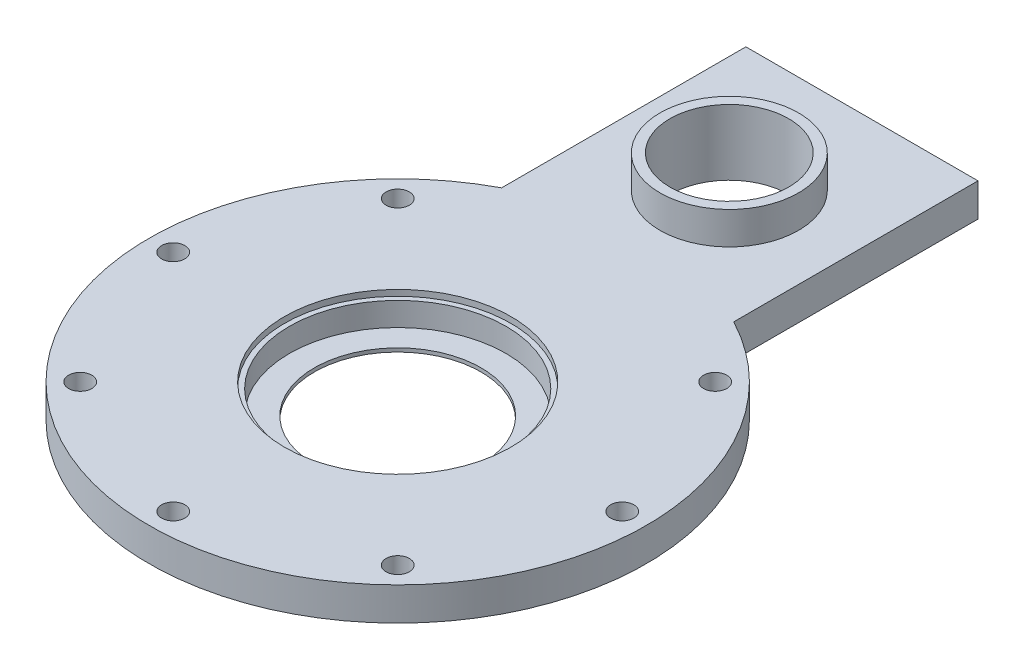
ISO-10303-21;
HEADER;
FILE_DESCRIPTION(('STEP AP214'),'2;1');
FILE_NAME('part.step','',(''),(''),'','','');
FILE_SCHEMA(('AUTOMOTIVE_DESIGN { 1 0 10303 214 1 1 1 1 }'));
ENDSEC;
DATA;
#1=APPLICATION_CONTEXT('core data for automotive mechanical design processes');
#2=APPLICATION_PROTOCOL_DEFINITION('international standard','automotive_design',2000,#1);
#3=PRODUCT_CONTEXT('',#1,'mechanical');
#4=PRODUCT('Part','Part','',(#3));
#5=PRODUCT_RELATED_PRODUCT_CATEGORY('part','',(#4));
#6=PRODUCT_DEFINITION_FORMATION('','',#4);
#7=PRODUCT_DEFINITION_CONTEXT('part definition',#1,'design');
#8=PRODUCT_DEFINITION('design','',#6,#7);
#9=PRODUCT_DEFINITION_SHAPE('','',#8);
#10=(LENGTH_UNIT() NAMED_UNIT(*) SI_UNIT(.MILLI.,.METRE.));
#11=(NAMED_UNIT(*) PLANE_ANGLE_UNIT() SI_UNIT($,.RADIAN.));
#12=(NAMED_UNIT(*) SI_UNIT($,.STERADIAN.) SOLID_ANGLE_UNIT());
#13=UNCERTAINTY_MEASURE_WITH_UNIT(LENGTH_MEASURE(1.E-05),#10,'distance_accuracy_value','');
#14=(GEOMETRIC_REPRESENTATION_CONTEXT(3) GLOBAL_UNCERTAINTY_ASSIGNED_CONTEXT((#13)) GLOBAL_UNIT_ASSIGNED_CONTEXT((#10,
#11,#12)) REPRESENTATION_CONTEXT('',''));
#15=CARTESIAN_POINT('',(0.,0.,0.));
#16=DIRECTION('',(0.,0.,1.));
#17=DIRECTION('',(1.,0.,0.));
#18=AXIS2_PLACEMENT_3D('',#15,#16,#17);
#19=CARTESIAN_POINT('',(0.,10.,100.));
#20=DIRECTION('',(0.,1.,0.));
#21=DIRECTION('',(0.,0.,1.));
#22=AXIS2_PLACEMENT_3D('',#19,#20,#21);
#23=PLANE('',#22);
#24=CARTESIAN_POINT('',(67.7000000000011,10.,99.9999999999993));
#25=DIRECTION('',(0.,1.,0.));
#26=DIRECTION('',(0.,0.,1.));
#27=AXIS2_PLACEMENT_3D('',#24,#25,#26);
#28=CIRCLE('',#27,3.49999999999997);
#29=CARTESIAN_POINT('',(67.7000000000011,10.,103.499999999999));
#30=VERTEX_POINT('',#29);
#31=EDGE_CURVE('E124',#30,#30,#28,.T.);
#32=ORIENTED_EDGE('',*,*,#31,.F.);
#33=EDGE_LOOP('',(#32));
#34=FACE_BOUND('',#33,.T.);
#35=CARTESIAN_POINT('',(47.8711290863305,10.,147.87112908633));
#36=DIRECTION('',(0.,1.,0.));
#37=DIRECTION('',(0.,0.,1.));
#38=AXIS2_PLACEMENT_3D('',#35,#36,#37);
#39=CIRCLE('',#38,3.49999999999997);
#40=CARTESIAN_POINT('',(47.8711290863305,10.,151.37112908633));
#41=VERTEX_POINT('',#40);
#42=EDGE_CURVE('E131',#41,#41,#39,.T.);
#43=ORIENTED_EDGE('',*,*,#42,.F.);
#44=EDGE_LOOP('',(#43));
#45=FACE_BOUND('',#44,.T.);
#46=CARTESIAN_POINT('',(4.44089209850063E-13,10.,167.700000000001));
#47=DIRECTION('',(0.,1.,0.));
#48=DIRECTION('',(0.,0.,1.));
#49=AXIS2_PLACEMENT_3D('',#46,#47,#48);
#50=CIRCLE('',#49,3.50000000000002);
#51=CARTESIAN_POINT('',(4.44089209850063E-13,10.,171.200000000001));
#52=VERTEX_POINT('',#51);
#53=EDGE_CURVE('E137',#52,#52,#50,.T.);
#54=ORIENTED_EDGE('',*,*,#53,.F.);
#55=EDGE_LOOP('',(#54));
#56=FACE_BOUND('',#55,.T.);
#57=CARTESIAN_POINT('',(-47.8711290863298,10.,147.87112908633));
#58=DIRECTION('',(0.,1.,0.));
#59=DIRECTION('',(0.,0.,1.));
#60=AXIS2_PLACEMENT_3D('',#57,#58,#59);
#61=CIRCLE('',#60,3.49999999999997);
#62=CARTESIAN_POINT('',(-47.8711290863298,10.,151.37112908633));
#63=VERTEX_POINT('',#62);
#64=EDGE_CURVE('E143',#63,#63,#61,.T.);
#65=ORIENTED_EDGE('',*,*,#64,.F.);
#66=EDGE_LOOP('',(#65));
#67=FACE_BOUND('',#66,.T.);
#68=CARTESIAN_POINT('',(-67.7000000000012,10.,100.));
#69=DIRECTION('',(0.,1.,0.));
#70=DIRECTION('',(0.,0.,1.));
#71=AXIS2_PLACEMENT_3D('',#68,#69,#70);
#72=CIRCLE('',#71,3.49999999999998);
#73=CARTESIAN_POINT('',(-67.7000000000012,10.,103.5));
#74=VERTEX_POINT('',#73);
#75=EDGE_CURVE('E111',#74,#74,#72,.T.);
#76=ORIENTED_EDGE('',*,*,#75,.F.);
#77=EDGE_LOOP('',(#76));
#78=FACE_BOUND('',#77,.T.);
#79=CARTESIAN_POINT('',(-47.8711290863301,10.,52.12887091367));
#80=DIRECTION('',(0.,1.,0.));
#81=DIRECTION('',(0.,0.,1.));
#82=AXIS2_PLACEMENT_3D('',#79,#80,#81);
#83=CIRCLE('',#82,3.50000000000003);
#84=CARTESIAN_POINT('',(-47.8711290863301,10.,55.62887091367));
#85=VERTEX_POINT('',#84);
#86=EDGE_CURVE('E118',#85,#85,#83,.T.);
#87=ORIENTED_EDGE('',*,*,#86,.F.);
#88=EDGE_LOOP('',(#87));
#89=FACE_BOUND('',#88,.T.);
#90=CARTESIAN_POINT('',(47.8711290863295,10.,52.1288709136694));
#91=DIRECTION('',(0.,1.,0.));
#92=DIRECTION('',(0.,0.,1.));
#93=AXIS2_PLACEMENT_3D('',#90,#91,#92);
#94=CIRCLE('',#93,3.50000000000002);
#95=CARTESIAN_POINT('',(47.8711290863295,10.,55.6288709136694));
#96=VERTEX_POINT('',#95);
#97=EDGE_CURVE('E127',#96,#96,#94,.T.);
#98=ORIENTED_EDGE('',*,*,#97,.F.);
#99=EDGE_LOOP('',(#98));
#100=FACE_BOUND('',#99,.T.);
#101=CARTESIAN_POINT('',(0.,10.,100.));
#102=DIRECTION('',(0.,1.,0.));
#103=DIRECTION('',(0.,0.,1.));
#104=AXIS2_PLACEMENT_3D('',#101,#102,#103);
#105=CIRCLE('',#104,34.15);
#106=CARTESIAN_POINT('',(0.,10.,134.15));
#107=VERTEX_POINT('',#106);
#108=EDGE_CURVE('E176',#107,#107,#105,.T.);
#109=ORIENTED_EDGE('',*,*,#108,.F.);
#110=EDGE_LOOP('',(#109));
#111=FACE_BOUND('',#110,.T.);
#112=CARTESIAN_POINT('',(0.,10.,0.));
#113=DIRECTION('',(0.,1.,0.));
#114=DIRECTION('',(0.,0.,1.));
#115=AXIS2_PLACEMENT_3D('',#112,#113,#114);
#116=CIRCLE('',#115,20.9);
#117=CARTESIAN_POINT('',(0.,10.,20.9));
#118=VERTEX_POINT('',#117);
#119=EDGE_CURVE('E161',#118,#118,#116,.T.);
#120=ORIENTED_EDGE('',*,*,#119,.F.);
#121=EDGE_LOOP('',(#120));
#122=FACE_BOUND('',#121,.T.);
#123=DIRECTION('',(0.,0.,-1.));
#124=VECTOR('',#123,1.);
#125=CARTESIAN_POINT('',(-34.999999999999,10.,0.));
#126=LINE('',#125,#124);
#127=CARTESIAN_POINT('',(-34.999999999999,10.,33.66750419289));
#128=VERTEX_POINT('',#127);
#129=CARTESIAN_POINT('',(-34.999999999999,10.,-40.0000000000003));
#130=VERTEX_POINT('',#129);
#131=EDGE_CURVE('E59',#128,#130,#126,.T.);
#132=ORIENTED_EDGE('',*,*,#131,.F.);
#133=CARTESIAN_POINT('',(0.,10.,100.));
#134=DIRECTION('',(0.,1.,0.));
#135=DIRECTION('',(0.,0.,1.));
#136=AXIS2_PLACEMENT_3D('',#133,#134,#135);
#137=CIRCLE('',#136,75.);
#138=CARTESIAN_POINT('',(34.999999999999,10.,33.66750419289));
#139=VERTEX_POINT('',#138);
#140=EDGE_CURVE('E84',#139,#128,#137,.F.);
#141=ORIENTED_EDGE('',*,*,#140,.F.);
#142=DIRECTION('',(0.,0.,-1.));
#143=VECTOR('',#142,1.);
#144=CARTESIAN_POINT('',(34.999999999999,10.,0.));
#145=LINE('',#144,#143);
#146=CARTESIAN_POINT('',(34.999999999999,10.,-39.9999999999998));
#147=VERTEX_POINT('',#146);
#148=EDGE_CURVE('E87',#139,#147,#145,.T.);
#149=ORIENTED_EDGE('',*,*,#148,.T.);
#150=DIRECTION('',(-1.,0.,0.));
#151=VECTOR('',#150,1.);
#152=CARTESIAN_POINT('',(2.71387850463927E-13,10.,-40.));
#153=LINE('',#152,#151);
#154=EDGE_CURVE('E156',#147,#130,#153,.T.);
#155=ORIENTED_EDGE('',*,*,#154,.T.);
#156=EDGE_LOOP('',(#132,#141,#149,#155));
#157=FACE_BOUND('',#156,.T.);
#158=ADVANCED_FACE('F42',(#34,#45,#56,#67,#78,#89,#100,#111,#122,#157),#23,.T.);
#159=CARTESIAN_POINT('',(0.,0.,100.));
#160=DIRECTION('',(0.,1.,0.));
#161=DIRECTION('',(0.,0.,1.));
#162=AXIS2_PLACEMENT_3D('',#159,#160,#161);
#163=PLANE('',#162);
#164=CARTESIAN_POINT('',(67.7000000000011,0.,99.9999999999993));
#165=DIRECTION('',(0.,1.,0.));
#166=DIRECTION('',(0.,0.,1.));
#167=AXIS2_PLACEMENT_3D('',#164,#165,#166);
#168=CIRCLE('',#167,3.49999999999997);
#169=CARTESIAN_POINT('',(67.7000000000011,0.,103.499999999999));
#170=VERTEX_POINT('',#169);
#171=EDGE_CURVE('E128',#170,#170,#168,.T.);
#172=ORIENTED_EDGE('',*,*,#171,.T.);
#173=EDGE_LOOP('',(#172));
#174=FACE_BOUND('',#173,.T.);
#175=CARTESIAN_POINT('',(47.8711290863305,0.,147.87112908633));
#176=DIRECTION('',(0.,1.,0.));
#177=DIRECTION('',(0.,0.,1.));
#178=AXIS2_PLACEMENT_3D('',#175,#176,#177);
#179=CIRCLE('',#178,3.49999999999997);
#180=CARTESIAN_POINT('',(47.8711290863305,0.,151.37112908633));
#181=VERTEX_POINT('',#180);
#182=EDGE_CURVE('E134',#181,#181,#179,.T.);
#183=ORIENTED_EDGE('',*,*,#182,.T.);
#184=EDGE_LOOP('',(#183));
#185=FACE_BOUND('',#184,.T.);
#186=CARTESIAN_POINT('',(4.44089209850063E-13,0.,167.700000000001));
#187=DIRECTION('',(0.,1.,0.));
#188=DIRECTION('',(0.,0.,1.));
#189=AXIS2_PLACEMENT_3D('',#186,#187,#188);
#190=CIRCLE('',#189,3.50000000000002);
#191=CARTESIAN_POINT('',(4.44089209850063E-13,0.,171.200000000001));
#192=VERTEX_POINT('',#191);
#193=EDGE_CURVE('E140',#192,#192,#190,.T.);
#194=ORIENTED_EDGE('',*,*,#193,.T.);
#195=EDGE_LOOP('',(#194));
#196=FACE_BOUND('',#195,.T.);
#197=CARTESIAN_POINT('',(-47.8711290863298,0.,147.87112908633));
#198=DIRECTION('',(0.,1.,0.));
#199=DIRECTION('',(0.,0.,1.));
#200=AXIS2_PLACEMENT_3D('',#197,#198,#199);
#201=CIRCLE('',#200,3.49999999999997);
#202=CARTESIAN_POINT('',(-47.8711290863298,0.,151.37112908633));
#203=VERTEX_POINT('',#202);
#204=EDGE_CURVE('E114',#203,#203,#201,.T.);
#205=ORIENTED_EDGE('',*,*,#204,.T.);
#206=EDGE_LOOP('',(#205));
#207=FACE_BOUND('',#206,.T.);
#208=CARTESIAN_POINT('',(-67.7000000000012,0.,100.));
#209=DIRECTION('',(0.,1.,0.));
#210=DIRECTION('',(0.,0.,1.));
#211=AXIS2_PLACEMENT_3D('',#208,#209,#210);
#212=CIRCLE('',#211,3.49999999999998);
#213=CARTESIAN_POINT('',(-67.7000000000012,0.,103.5));
#214=VERTEX_POINT('',#213);
#215=EDGE_CURVE('E115',#214,#214,#212,.T.);
#216=ORIENTED_EDGE('',*,*,#215,.T.);
#217=EDGE_LOOP('',(#216));
#218=FACE_BOUND('',#217,.T.);
#219=CARTESIAN_POINT('',(-47.8711290863301,0.,52.12887091367));
#220=DIRECTION('',(0.,1.,0.));
#221=DIRECTION('',(0.,0.,1.));
#222=AXIS2_PLACEMENT_3D('',#219,#220,#221);
#223=CIRCLE('',#222,3.50000000000003);
#224=CARTESIAN_POINT('',(-47.8711290863301,0.,55.62887091367));
#225=VERTEX_POINT('',#224);
#226=EDGE_CURVE('E121',#225,#225,#223,.T.);
#227=ORIENTED_EDGE('',*,*,#226,.T.);
#228=EDGE_LOOP('',(#227));
#229=FACE_BOUND('',#228,.T.);
#230=CARTESIAN_POINT('',(47.8711290863295,0.,52.1288709136694));
#231=DIRECTION('',(0.,1.,0.));
#232=DIRECTION('',(0.,0.,1.));
#233=AXIS2_PLACEMENT_3D('',#230,#231,#232);
#234=CIRCLE('',#233,3.50000000000002);
#235=CARTESIAN_POINT('',(47.8711290863295,0.,55.6288709136694));
#236=VERTEX_POINT('',#235);
#237=EDGE_CURVE('E148',#236,#236,#234,.T.);
#238=ORIENTED_EDGE('',*,*,#237,.T.);
#239=EDGE_LOOP('',(#238));
#240=FACE_BOUND('',#239,.T.);
#241=CARTESIAN_POINT('',(0.,0.,0.));
#242=DIRECTION('',(0.,1.,0.));
#243=DIRECTION('',(0.,0.,1.));
#244=AXIS2_PLACEMENT_3D('',#241,#242,#243);
#245=CIRCLE('',#244,17.9);
#246=CARTESIAN_POINT('',(0.,0.,17.9));
#247=VERTEX_POINT('',#246);
#248=EDGE_CURVE('E11',#247,#247,#245,.T.);
#249=ORIENTED_EDGE('',*,*,#248,.T.);
#250=EDGE_LOOP('',(#249));
#251=FACE_BOUND('',#250,.T.);
#252=CARTESIAN_POINT('',(0.,0.,100.));
#253=DIRECTION('',(0.,1.,0.));
#254=DIRECTION('',(0.,0.,1.));
#255=AXIS2_PLACEMENT_3D('',#252,#253,#254);
#256=CIRCLE('',#255,25.15);
#257=CARTESIAN_POINT('',(0.,0.,125.15));
#258=VERTEX_POINT('',#257);
#259=EDGE_CURVE('E51',#258,#258,#256,.T.);
#260=ORIENTED_EDGE('',*,*,#259,.T.);
#261=EDGE_LOOP('',(#260));
#262=FACE_BOUND('',#261,.T.);
#263=CARTESIAN_POINT('',(0.,0.,100.));
#264=DIRECTION('',(0.,-1.,0.));
#265=DIRECTION('',(0.,0.,-1.));
#266=AXIS2_PLACEMENT_3D('',#263,#264,#265);
#267=CIRCLE('',#266,75.);
#268=CARTESIAN_POINT('',(34.999999999999,0.,33.66750419289));
#269=VERTEX_POINT('',#268);
#270=CARTESIAN_POINT('',(-34.999999999999,0.,33.66750419289));
#271=VERTEX_POINT('',#270);
#272=EDGE_CURVE('E93',#269,#271,#267,.T.);
#273=ORIENTED_EDGE('',*,*,#272,.T.);
#274=DIRECTION('',(0.,0.,-1.));
#275=VECTOR('',#274,1.);
#276=CARTESIAN_POINT('',(-34.999999999999,0.,0.));
#277=LINE('',#276,#275);
#278=CARTESIAN_POINT('',(-34.999999999999,0.,-40.0000000000003));
#279=VERTEX_POINT('',#278);
#280=EDGE_CURVE('E106',#271,#279,#277,.T.);
#281=ORIENTED_EDGE('',*,*,#280,.T.);
#282=DIRECTION('',(-1.,0.,0.));
#283=VECTOR('',#282,1.);
#284=CARTESIAN_POINT('',(2.71387850463927E-13,0.,-40.));
#285=LINE('',#284,#283);
#286=CARTESIAN_POINT('',(34.999999999999,0.,-39.9999999999998));
#287=VERTEX_POINT('',#286);
#288=EDGE_CURVE('E151',#287,#279,#285,.T.);
#289=ORIENTED_EDGE('',*,*,#288,.F.);
#290=DIRECTION('',(0.,0.,-1.));
#291=VECTOR('',#290,1.);
#292=CARTESIAN_POINT('',(34.999999999999,0.,0.));
#293=LINE('',#292,#291);
#294=EDGE_CURVE('E102',#269,#287,#293,.T.);
#295=ORIENTED_EDGE('',*,*,#294,.F.);
#296=EDGE_LOOP('',(#273,#281,#289,#295));
#297=FACE_BOUND('',#296,.T.);
#298=ADVANCED_FACE('F44',(#174,#185,#196,#207,#218,#229,#240,#251,#262,#297),#163,.F.);
#299=CARTESIAN_POINT('',(2.71387850463927E-13,205.039141144791,-40.));
#300=DIRECTION('',(0.,0.,1.));
#301=DIRECTION('',(1.,0.,0.));
#302=AXIS2_PLACEMENT_3D('',#299,#300,#301);
#303=PLANE('',#302);
#304=ORIENTED_EDGE('',*,*,#288,.T.);
#305=DIRECTION('',(0.,1.,0.));
#306=VECTOR('',#305,1.);
#307=CARTESIAN_POINT('',(-34.999999999999,0.,-40.0000000000003));
#308=LINE('',#307,#306);
#309=EDGE_CURVE('E64',#279,#130,#308,.T.);
#310=ORIENTED_EDGE('',*,*,#309,.T.);
#311=ORIENTED_EDGE('',*,*,#154,.F.);
#312=DIRECTION('',(0.,1.,0.));
#313=VECTOR('',#312,1.);
#314=CARTESIAN_POINT('',(34.999999999999,0.,-39.9999999999998));
#315=LINE('',#314,#313);
#316=EDGE_CURVE('E101',#287,#147,#315,.T.);
#317=ORIENTED_EDGE('',*,*,#316,.F.);
#318=EDGE_LOOP('',(#304,#310,#311,#317));
#319=FACE_BOUND('',#318,.T.);
#320=ADVANCED_FACE('F187',(#319),#303,.F.);
#321=CARTESIAN_POINT('',(0.,0.,100.));
#322=DIRECTION('',(0.,1.,0.));
#323=DIRECTION('',(0.,0.,1.));
#324=AXIS2_PLACEMENT_3D('',#321,#322,#323);
#325=CYLINDRICAL_SURFACE('',#324,25.15);
#326=ORIENTED_EDGE('',*,*,#259,.F.);
#327=EDGE_LOOP('',(#326));
#328=FACE_BOUND('',#327,.T.);
#329=CARTESIAN_POINT('',(0.,1.1,100.));
#330=DIRECTION('',(0.,1.,0.));
#331=DIRECTION('',(0.,0.,1.));
#332=AXIS2_PLACEMENT_3D('',#329,#330,#331);
#333=CIRCLE('',#332,25.15);
#334=CARTESIAN_POINT('',(0.,1.1,125.15));
#335=VERTEX_POINT('',#334);
#336=EDGE_CURVE('E46',#335,#335,#333,.F.);
#337=ORIENTED_EDGE('',*,*,#336,.F.);
#338=EDGE_LOOP('',(#337));
#339=FACE_BOUND('',#338,.T.);
#340=ADVANCED_FACE('F183',(#328,#339),#325,.F.);
#341=CARTESIAN_POINT('',(0.,0.,0.));
#342=DIRECTION('',(0.,1.,0.));
#343=DIRECTION('',(0.,0.,1.));
#344=AXIS2_PLACEMENT_3D('',#341,#342,#343);
#345=CYLINDRICAL_SURFACE('',#344,17.9);
#346=ORIENTED_EDGE('',*,*,#248,.F.);
#347=EDGE_LOOP('',(#346));
#348=FACE_BOUND('',#347,.T.);
#349=CARTESIAN_POINT('',(0.,19.8,0.));
#350=DIRECTION('',(0.,1.,0.));
#351=DIRECTION('',(0.,0.,1.));
#352=AXIS2_PLACEMENT_3D('',#349,#350,#351);
#353=CIRCLE('',#352,17.9);
#354=CARTESIAN_POINT('',(0.,19.8,17.9));
#355=VERTEX_POINT('',#354);
#356=EDGE_CURVE('E92',#355,#355,#353,.T.);
#357=ORIENTED_EDGE('',*,*,#356,.T.);
#358=EDGE_LOOP('',(#357));
#359=FACE_BOUND('',#358,.T.);
#360=ADVANCED_FACE('F186',(#348,#359),#345,.F.);
#361=CARTESIAN_POINT('',(0.,8.2,100.));
#362=DIRECTION('',(0.,1.,0.));
#363=DIRECTION('',(0.,0.,1.));
#364=AXIS2_PLACEMENT_3D('',#361,#362,#363);
#365=PLANE('',#364);
#366=CARTESIAN_POINT('',(0.,8.2,100.));
#367=DIRECTION('',(0.,1.,0.));
#368=DIRECTION('',(0.,0.,1.));
#369=AXIS2_PLACEMENT_3D('',#366,#367,#368);
#370=CIRCLE('',#369,32.65);
#371=CARTESIAN_POINT('',(0.,8.2,132.65));
#372=VERTEX_POINT('',#371);
#373=EDGE_CURVE('E165',#372,#372,#370,.T.);
#374=ORIENTED_EDGE('',*,*,#373,.F.);
#375=EDGE_LOOP('',(#374));
#376=FACE_BOUND('',#375,.T.);
#377=CARTESIAN_POINT('',(0.,8.2,100.));
#378=DIRECTION('',(0.,1.,0.));
#379=DIRECTION('',(0.,0.,1.));
#380=AXIS2_PLACEMENT_3D('',#377,#378,#379);
#381=CIRCLE('',#380,34.15);
#382=CARTESIAN_POINT('',(0.,8.2,134.15));
#383=VERTEX_POINT('',#382);
#384=EDGE_CURVE('E173',#383,#383,#381,.T.);
#385=ORIENTED_EDGE('',*,*,#384,.T.);
#386=EDGE_LOOP('',(#385));
#387=FACE_BOUND('',#386,.T.);
#388=ADVANCED_FACE('F206',(#376,#387),#365,.T.);
#389=CARTESIAN_POINT('',(0.,8.2,100.));
#390=DIRECTION('',(0.,1.,0.));
#391=DIRECTION('',(0.,0.,1.));
#392=AXIS2_PLACEMENT_3D('',#389,#390,#391);
#393=CYLINDRICAL_SURFACE('',#392,34.15);
#394=ORIENTED_EDGE('',*,*,#384,.F.);
#395=EDGE_LOOP('',(#394));
#396=FACE_BOUND('',#395,.T.);
#397=ORIENTED_EDGE('',*,*,#108,.T.);
#398=EDGE_LOOP('',(#397));
#399=FACE_BOUND('',#398,.T.);
#400=ADVANCED_FACE('F195',(#396,#399),#393,.F.);
#401=CARTESIAN_POINT('',(0.,1.1,100.));
#402=DIRECTION('',(0.,1.,0.));
#403=DIRECTION('',(0.,0.,1.));
#404=AXIS2_PLACEMENT_3D('',#401,#402,#403);
#405=PLANE('',#404);
#406=CARTESIAN_POINT('',(0.,1.1,100.));
#407=DIRECTION('',(0.,1.,0.));
#408=DIRECTION('',(0.,0.,1.));
#409=AXIS2_PLACEMENT_3D('',#406,#407,#408);
#410=CIRCLE('',#409,32.65);
#411=CARTESIAN_POINT('',(0.,1.1,132.65));
#412=VERTEX_POINT('',#411);
#413=EDGE_CURVE('E168',#412,#412,#410,.T.);
#414=ORIENTED_EDGE('',*,*,#413,.T.);
#415=EDGE_LOOP('',(#414));
#416=FACE_BOUND('',#415,.T.);
#417=ORIENTED_EDGE('',*,*,#336,.T.);
#418=EDGE_LOOP('',(#417));
#419=FACE_BOUND('',#418,.T.);
#420=ADVANCED_FACE('F192',(#416,#419),#405,.T.);
#421=CARTESIAN_POINT('',(0.,1.1,100.));
#422=DIRECTION('',(0.,1.,0.));
#423=DIRECTION('',(0.,0.,1.));
#424=AXIS2_PLACEMENT_3D('',#421,#422,#423);
#425=CYLINDRICAL_SURFACE('',#424,32.65);
#426=ORIENTED_EDGE('',*,*,#413,.F.);
#427=EDGE_LOOP('',(#426));
#428=FACE_BOUND('',#427,.T.);
#429=ORIENTED_EDGE('',*,*,#373,.T.);
#430=EDGE_LOOP('',(#429));
#431=FACE_BOUND('',#430,.T.);
#432=ADVANCED_FACE('F194',(#428,#431),#425,.F.);
#433=CARTESIAN_POINT('',(0.,19.8,0.));
#434=DIRECTION('',(0.,1.,0.));
#435=DIRECTION('',(0.,0.,1.));
#436=AXIS2_PLACEMENT_3D('',#433,#434,#435);
#437=PLANE('',#436);
#438=CARTESIAN_POINT('',(0.,19.8,0.));
#439=DIRECTION('',(0.,1.,0.));
#440=DIRECTION('',(0.,0.,1.));
#441=AXIS2_PLACEMENT_3D('',#438,#439,#440);
#442=CIRCLE('',#441,20.9);
#443=CARTESIAN_POINT('',(0.,19.8,20.9));
#444=VERTEX_POINT('',#443);
#445=EDGE_CURVE('E162',#444,#444,#442,.T.);
#446=ORIENTED_EDGE('',*,*,#445,.T.);
#447=EDGE_LOOP('',(#446));
#448=FACE_BOUND('',#447,.T.);
#449=ORIENTED_EDGE('',*,*,#356,.F.);
#450=EDGE_LOOP('',(#449));
#451=FACE_BOUND('',#450,.T.);
#452=ADVANCED_FACE('F202',(#448,#451),#437,.T.);
#453=CARTESIAN_POINT('',(0.,19.8,0.));
#454=DIRECTION('',(0.,-1.,0.));
#455=DIRECTION('',(0.,0.,-1.));
#456=AXIS2_PLACEMENT_3D('',#453,#454,#455);
#457=CYLINDRICAL_SURFACE('',#456,20.9);
#458=ORIENTED_EDGE('',*,*,#445,.F.);
#459=EDGE_LOOP('',(#458));
#460=FACE_BOUND('',#459,.T.);
#461=ORIENTED_EDGE('',*,*,#119,.T.);
#462=EDGE_LOOP('',(#461));
#463=FACE_BOUND('',#462,.T.);
#464=ADVANCED_FACE('F235',(#460,#463),#457,.T.);
#465=CARTESIAN_POINT('',(0.,205.039141144791,100.));
#466=DIRECTION('',(0.,-1.,0.));
#467=DIRECTION('',(0.,0.,-1.));
#468=AXIS2_PLACEMENT_3D('',#465,#466,#467);
#469=CYLINDRICAL_SURFACE('',#468,75.);
#470=ORIENTED_EDGE('',*,*,#272,.F.);
#471=DIRECTION('',(0.,1.,0.));
#472=VECTOR('',#471,1.);
#473=CARTESIAN_POINT('',(34.999999999999,0.,33.66750419289));
#474=LINE('',#473,#472);
#475=EDGE_CURVE('E98',#269,#139,#474,.T.);
#476=ORIENTED_EDGE('',*,*,#475,.T.);
#477=ORIENTED_EDGE('',*,*,#140,.T.);
#478=DIRECTION('',(0.,1.,0.));
#479=VECTOR('',#478,1.);
#480=CARTESIAN_POINT('',(-34.999999999999,0.,33.66750419289));
#481=LINE('',#480,#479);
#482=EDGE_CURVE('E481',#271,#128,#481,.T.);
#483=ORIENTED_EDGE('',*,*,#482,.F.);
#484=EDGE_LOOP('',(#470,#476,#477,#483));
#485=FACE_BOUND('',#484,.T.);
#486=ADVANCED_FACE('F104',(#485),#469,.T.);
#487=CARTESIAN_POINT('',(47.8711290863295,0.,52.1288709136694));
#488=DIRECTION('',(0.,1.,0.));
#489=DIRECTION('',(0.,0.,1.));
#490=AXIS2_PLACEMENT_3D('',#487,#488,#489);
#491=CYLINDRICAL_SURFACE('',#490,3.50000000000002);
#492=ORIENTED_EDGE('',*,*,#237,.F.);
#493=EDGE_LOOP('',(#492));
#494=FACE_BOUND('',#493,.T.);
#495=ORIENTED_EDGE('',*,*,#97,.T.);
#496=EDGE_LOOP('',(#495));
#497=FACE_BOUND('',#496,.T.);
#498=ADVANCED_FACE('F243',(#494,#497),#491,.F.);
#499=CARTESIAN_POINT('',(-47.8711290863301,0.,52.12887091367));
#500=DIRECTION('',(0.,1.,0.));
#501=DIRECTION('',(0.,0.,1.));
#502=AXIS2_PLACEMENT_3D('',#499,#500,#501);
#503=CYLINDRICAL_SURFACE('',#502,3.50000000000003);
#504=ORIENTED_EDGE('',*,*,#226,.F.);
#505=EDGE_LOOP('',(#504));
#506=FACE_BOUND('',#505,.T.);
#507=ORIENTED_EDGE('',*,*,#86,.T.);
#508=EDGE_LOOP('',(#507));
#509=FACE_BOUND('',#508,.T.);
#510=ADVANCED_FACE('F253',(#506,#509),#503,.F.);
#511=CARTESIAN_POINT('',(-67.7000000000012,0.,100.));
#512=DIRECTION('',(0.,1.,0.));
#513=DIRECTION('',(0.,0.,1.));
#514=AXIS2_PLACEMENT_3D('',#511,#512,#513);
#515=CYLINDRICAL_SURFACE('',#514,3.49999999999998);
#516=ORIENTED_EDGE('',*,*,#215,.F.);
#517=EDGE_LOOP('',(#516));
#518=FACE_BOUND('',#517,.T.);
#519=ORIENTED_EDGE('',*,*,#75,.T.);
#520=EDGE_LOOP('',(#519));
#521=FACE_BOUND('',#520,.T.);
#522=ADVANCED_FACE('F259',(#518,#521),#515,.F.);
#523=CARTESIAN_POINT('',(-47.8711290863298,0.,147.87112908633));
#524=DIRECTION('',(0.,1.,0.));
#525=DIRECTION('',(0.,0.,1.));
#526=AXIS2_PLACEMENT_3D('',#523,#524,#525);
#527=CYLINDRICAL_SURFACE('',#526,3.49999999999997);
#528=ORIENTED_EDGE('',*,*,#204,.F.);
#529=EDGE_LOOP('',(#528));
#530=FACE_BOUND('',#529,.T.);
#531=ORIENTED_EDGE('',*,*,#64,.T.);
#532=EDGE_LOOP('',(#531));
#533=FACE_BOUND('',#532,.T.);
#534=ADVANCED_FACE('F255',(#530,#533),#527,.F.);
#535=CARTESIAN_POINT('',(4.44089209850063E-13,0.,167.700000000001));
#536=DIRECTION('',(0.,1.,0.));
#537=DIRECTION('',(0.,0.,1.));
#538=AXIS2_PLACEMENT_3D('',#535,#536,#537);
#539=CYLINDRICAL_SURFACE('',#538,3.50000000000002);
#540=ORIENTED_EDGE('',*,*,#193,.F.);
#541=EDGE_LOOP('',(#540));
#542=FACE_BOUND('',#541,.T.);
#543=ORIENTED_EDGE('',*,*,#53,.T.);
#544=EDGE_LOOP('',(#543));
#545=FACE_BOUND('',#544,.T.);
#546=ADVANCED_FACE('F258',(#542,#545),#539,.F.);
#547=CARTESIAN_POINT('',(47.8711290863305,0.,147.87112908633));
#548=DIRECTION('',(0.,1.,0.));
#549=DIRECTION('',(0.,0.,1.));
#550=AXIS2_PLACEMENT_3D('',#547,#548,#549);
#551=CYLINDRICAL_SURFACE('',#550,3.49999999999997);
#552=ORIENTED_EDGE('',*,*,#182,.F.);
#553=EDGE_LOOP('',(#552));
#554=FACE_BOUND('',#553,.T.);
#555=ORIENTED_EDGE('',*,*,#42,.T.);
#556=EDGE_LOOP('',(#555));
#557=FACE_BOUND('',#556,.T.);
#558=ADVANCED_FACE('F263',(#554,#557),#551,.F.);
#559=CARTESIAN_POINT('',(67.7000000000011,0.,99.9999999999993));
#560=DIRECTION('',(0.,1.,0.));
#561=DIRECTION('',(0.,0.,1.));
#562=AXIS2_PLACEMENT_3D('',#559,#560,#561);
#563=CYLINDRICAL_SURFACE('',#562,3.49999999999997);
#564=ORIENTED_EDGE('',*,*,#171,.F.);
#565=EDGE_LOOP('',(#564));
#566=FACE_BOUND('',#565,.T.);
#567=ORIENTED_EDGE('',*,*,#31,.T.);
#568=EDGE_LOOP('',(#567));
#569=FACE_BOUND('',#568,.T.);
#570=ADVANCED_FACE('F267',(#566,#569),#563,.F.);
#571=CARTESIAN_POINT('',(34.999999999999,0.,0.));
#572=DIRECTION('',(1.,0.,0.));
#573=DIRECTION('',(0.,0.,-1.));
#574=AXIS2_PLACEMENT_3D('',#571,#572,#573);
#575=PLANE('',#574);
#576=ORIENTED_EDGE('',*,*,#148,.F.);
#577=ORIENTED_EDGE('',*,*,#475,.F.);
#578=ORIENTED_EDGE('',*,*,#294,.T.);
#579=ORIENTED_EDGE('',*,*,#316,.T.);
#580=EDGE_LOOP('',(#576,#577,#578,#579));
#581=FACE_BOUND('',#580,.T.);
#582=ADVANCED_FACE('F97',(#581),#575,.T.);
#583=CARTESIAN_POINT('',(-34.999999999999,0.,0.));
#584=DIRECTION('',(1.,0.,0.));
#585=DIRECTION('',(0.,0.,-1.));
#586=AXIS2_PLACEMENT_3D('',#583,#584,#585);
#587=PLANE('',#586);
#588=ORIENTED_EDGE('',*,*,#131,.T.);
#589=ORIENTED_EDGE('',*,*,#309,.F.);
#590=ORIENTED_EDGE('',*,*,#280,.F.);
#591=ORIENTED_EDGE('',*,*,#482,.T.);
#592=EDGE_LOOP('',(#588,#589,#590,#591));
#593=FACE_BOUND('',#592,.T.);
#594=ADVANCED_FACE('F279',(#593),#587,.F.);
#595=CLOSED_SHELL('',(#158,#298,#320,#340,#360,#388,#400,#420,#432,#452,#464,#486,#498,#510,
#522,#534,#546,#558,#570,#582,#594));
#596=MANIFOLD_SOLID_BREP('B2',#595);
#597=ADVANCED_BREP_SHAPE_REPRESENTATION('',(#18,#596),#14);
#598=SHAPE_DEFINITION_REPRESENTATION(#9,#597);
ENDSEC;
END-ISO-10303-21;
